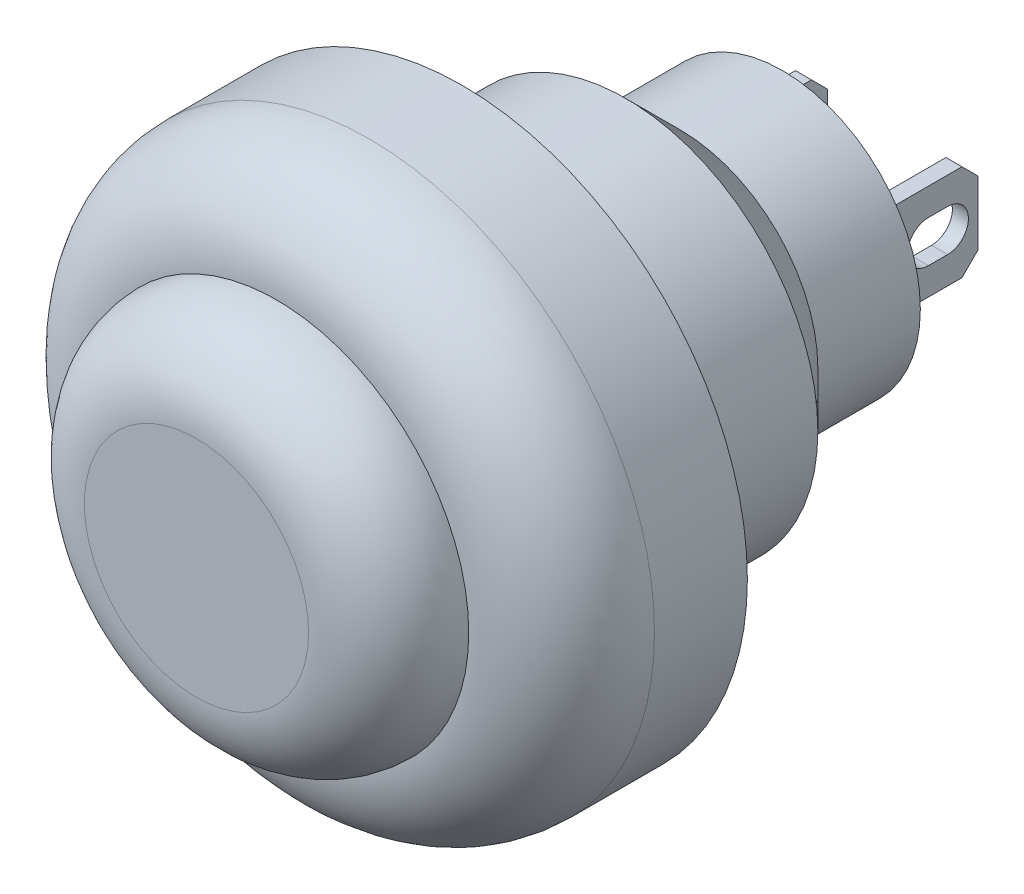
ISO-10303-21;
HEADER;
FILE_DESCRIPTION(('STEP AP214'),'2;1');
FILE_NAME('part.step','',(''),(''),'','','');
FILE_SCHEMA(('AUTOMOTIVE_DESIGN { 1 0 10303 214 1 1 1 1 }'));
ENDSEC;
DATA;
#1=APPLICATION_CONTEXT('core data for automotive mechanical design processes');
#2=APPLICATION_PROTOCOL_DEFINITION('international standard','automotive_design',2000,#1);
#3=PRODUCT_CONTEXT('',#1,'mechanical');
#4=PRODUCT('Part','Part','',(#3));
#5=PRODUCT_RELATED_PRODUCT_CATEGORY('part','',(#4));
#6=PRODUCT_DEFINITION_FORMATION('','',#4);
#7=PRODUCT_DEFINITION_CONTEXT('part definition',#1,'design');
#8=PRODUCT_DEFINITION('design','',#6,#7);
#9=PRODUCT_DEFINITION_SHAPE('','',#8);
#10=(LENGTH_UNIT() NAMED_UNIT(*) SI_UNIT(.MILLI.,.METRE.));
#11=(NAMED_UNIT(*) PLANE_ANGLE_UNIT() SI_UNIT($,.RADIAN.));
#12=(NAMED_UNIT(*) SI_UNIT($,.STERADIAN.) SOLID_ANGLE_UNIT());
#13=UNCERTAINTY_MEASURE_WITH_UNIT(LENGTH_MEASURE(1.E-05),#10,'distance_accuracy_value','');
#14=(GEOMETRIC_REPRESENTATION_CONTEXT(3) GLOBAL_UNCERTAINTY_ASSIGNED_CONTEXT((#13)) GLOBAL_UNIT_ASSIGNED_CONTEXT((#10,
#11,#12)) REPRESENTATION_CONTEXT('',''));
#15=CARTESIAN_POINT('',(0.,0.,0.));
#16=DIRECTION('',(0.,0.,1.));
#17=DIRECTION('',(1.,0.,0.));
#18=AXIS2_PLACEMENT_3D('',#15,#16,#17);
#19=CARTESIAN_POINT('',(0.,0.,-10.));
#20=DIRECTION('',(0.,0.,-1.));
#21=DIRECTION('',(-1.,0.,0.));
#22=AXIS2_PLACEMENT_3D('',#19,#20,#21);
#23=PLANE('',#22);
#24=CARTESIAN_POINT('',(0.,0.,-10.));
#25=DIRECTION('',(0.,0.,-1.));
#26=DIRECTION('',(-1.,0.,0.));
#27=AXIS2_PLACEMENT_3D('',#24,#25,#26);
#28=CIRCLE('',#27,4.3);
#29=CARTESIAN_POINT('',(-4.3,0.,-10.));
#30=VERTEX_POINT('',#29);
#31=EDGE_CURVE('E286',#30,#30,#28,.T.);
#32=ORIENTED_EDGE('',*,*,#31,.T.);
#33=EDGE_LOOP('',(#32));
#34=FACE_BOUND('',#33,.T.);
#35=DIRECTION('',(0.,1.,0.));
#36=VECTOR('',#35,1.);
#37=CARTESIAN_POINT('',(-2.6,-1.5,-10.));
#38=LINE('',#37,#36);
#39=CARTESIAN_POINT('',(-2.6,-1.5,-10.));
#40=VERTEX_POINT('',#39);
#41=CARTESIAN_POINT('',(-2.6,1.5,-10.));
#42=VERTEX_POINT('',#41);
#43=EDGE_CURVE('E271',#40,#42,#38,.T.);
#44=ORIENTED_EDGE('',*,*,#43,.F.);
#45=DIRECTION('',(-1.,0.,0.));
#46=VECTOR('',#45,1.);
#47=CARTESIAN_POINT('',(-2.1,-1.5,-10.));
#48=LINE('',#47,#46);
#49=CARTESIAN_POINT('',(-2.1,-1.5,-10.));
#50=VERTEX_POINT('',#49);
#51=EDGE_CURVE('E260',#50,#40,#48,.T.);
#52=ORIENTED_EDGE('',*,*,#51,.F.);
#53=DIRECTION('',(0.,-1.,0.));
#54=VECTOR('',#53,1.);
#55=CARTESIAN_POINT('',(-2.1,0.,-10.));
#56=LINE('',#55,#54);
#57=CARTESIAN_POINT('',(-2.1,1.5,-10.));
#58=VERTEX_POINT('',#57);
#59=EDGE_CURVE('E265',#58,#50,#56,.T.);
#60=ORIENTED_EDGE('',*,*,#59,.F.);
#61=DIRECTION('',(1.,0.,0.));
#62=VECTOR('',#61,1.);
#63=CARTESIAN_POINT('',(-2.6,1.5,-10.));
#64=LINE('',#63,#62);
#65=EDGE_CURVE('E274',#42,#58,#64,.T.);
#66=ORIENTED_EDGE('',*,*,#65,.F.);
#67=EDGE_LOOP('',(#44,#52,#60,#66));
#68=FACE_BOUND('',#67,.T.);
#69=DIRECTION('',(-1.,0.,0.));
#70=VECTOR('',#69,1.);
#71=CARTESIAN_POINT('',(2.6,-1.5,-10.));
#72=LINE('',#71,#70);
#73=CARTESIAN_POINT('',(2.6,-1.5,-10.));
#74=VERTEX_POINT('',#73);
#75=CARTESIAN_POINT('',(2.1,-1.5,-10.));
#76=VERTEX_POINT('',#75);
#77=EDGE_CURVE('E245',#74,#76,#72,.T.);
#78=ORIENTED_EDGE('',*,*,#77,.F.);
#79=DIRECTION('',(0.,-1.,0.));
#80=VECTOR('',#79,1.);
#81=CARTESIAN_POINT('',(2.6,-1.5,-10.));
#82=LINE('',#81,#80);
#83=CARTESIAN_POINT('',(2.6,1.5,-10.));
#84=VERTEX_POINT('',#83);
#85=EDGE_CURVE('E234',#84,#74,#82,.T.);
#86=ORIENTED_EDGE('',*,*,#85,.F.);
#87=DIRECTION('',(1.,0.,0.));
#88=VECTOR('',#87,1.);
#89=CARTESIAN_POINT('',(2.6,1.5,-10.));
#90=LINE('',#89,#88);
#91=CARTESIAN_POINT('',(2.1,1.5,-10.));
#92=VERTEX_POINT('',#91);
#93=EDGE_CURVE('E239',#92,#84,#90,.T.);
#94=ORIENTED_EDGE('',*,*,#93,.F.);
#95=DIRECTION('',(0.,1.,0.));
#96=VECTOR('',#95,1.);
#97=CARTESIAN_POINT('',(2.1,0.,-10.));
#98=LINE('',#97,#96);
#99=EDGE_CURVE('E248',#76,#92,#98,.T.);
#100=ORIENTED_EDGE('',*,*,#99,.F.);
#101=EDGE_LOOP('',(#78,#86,#94,#100));
#102=FACE_BOUND('',#101,.T.);
#103=ADVANCED_FACE('F36',(#34,#68,#102),#23,.T.);
#104=CARTESIAN_POINT('',(0.,0.,5.8));
#105=DIRECTION('',(0.,0.,-1.));
#106=DIRECTION('',(-1.,0.,0.));
#107=AXIS2_PLACEMENT_3D('',#104,#105,#106);
#108=CYLINDRICAL_SURFACE('',#107,8.9);
#109=CARTESIAN_POINT('',(0.,0.,2.9));
#110=DIRECTION('',(0.,0.,1.));
#111=DIRECTION('',(1.,0.,0.));
#112=AXIS2_PLACEMENT_3D('',#109,#110,#111);
#113=CIRCLE('',#112,8.9);
#114=CARTESIAN_POINT('',(8.9,0.,2.9));
#115=VERTEX_POINT('',#114);
#116=EDGE_CURVE('E301',#115,#115,#113,.F.);
#117=ORIENTED_EDGE('',*,*,#116,.T.);
#118=EDGE_LOOP('',(#117));
#119=FACE_BOUND('',#118,.T.);
#120=CARTESIAN_POINT('',(0.,0.,0.));
#121=DIRECTION('',(0.,0.,1.));
#122=DIRECTION('',(1.,0.,0.));
#123=AXIS2_PLACEMENT_3D('',#120,#121,#122);
#124=CIRCLE('',#123,8.9);
#125=CARTESIAN_POINT('',(8.9,0.,0.));
#126=VERTEX_POINT('',#125);
#127=EDGE_CURVE('E295',#126,#126,#124,.T.);
#128=ORIENTED_EDGE('',*,*,#127,.T.);
#129=EDGE_LOOP('',(#128));
#130=FACE_BOUND('',#129,.T.);
#131=ADVANCED_FACE('F381',(#119,#130),#108,.T.);
#132=CARTESIAN_POINT('',(0.,0.,0.));
#133=DIRECTION('',(0.,0.,1.));
#134=DIRECTION('',(1.,0.,0.));
#135=AXIS2_PLACEMENT_3D('',#132,#133,#134);
#136=PLANE('',#135);
#137=CARTESIAN_POINT('',(0.,0.,0.));
#138=DIRECTION('',(0.,0.,1.));
#139=DIRECTION('',(1.,0.,0.));
#140=AXIS2_PLACEMENT_3D('',#137,#138,#139);
#141=CIRCLE('',#140,6.75);
#142=CARTESIAN_POINT('',(6.75,0.,0.));
#143=VERTEX_POINT('',#142);
#144=EDGE_CURVE('E304',#143,#143,#141,.F.);
#145=ORIENTED_EDGE('',*,*,#144,.F.);
#146=EDGE_LOOP('',(#145));
#147=FACE_BOUND('',#146,.T.);
#148=ORIENTED_EDGE('',*,*,#127,.F.);
#149=EDGE_LOOP('',(#148));
#150=FACE_BOUND('',#149,.T.);
#151=ADVANCED_FACE('F387',(#147,#150),#136,.F.);
#152=CARTESIAN_POINT('',(0.,0.,2.9));
#153=DIRECTION('',(0.,0.,1.));
#154=DIRECTION('',(1.,0.,0.));
#155=AXIS2_PLACEMENT_3D('',#152,#153,#154);
#156=TOROIDAL_SURFACE('',#155,6.,2.9);
#157=ORIENTED_EDGE('',*,*,#116,.F.);
#158=EDGE_LOOP('',(#157));
#159=FACE_BOUND('',#158,.T.);
#160=CARTESIAN_POINT('',(0.,0.,5.8));
#161=DIRECTION('',(0.,0.,1.));
#162=DIRECTION('',(1.,0.,0.));
#163=AXIS2_PLACEMENT_3D('',#160,#161,#162);
#164=CIRCLE('',#163,6.);
#165=CARTESIAN_POINT('',(6.,0.,5.8));
#166=VERTEX_POINT('',#165);
#167=EDGE_CURVE('E298',#166,#166,#164,.T.);
#168=ORIENTED_EDGE('',*,*,#167,.F.);
#169=EDGE_LOOP('',(#168));
#170=FACE_BOUND('',#169,.T.);
#171=ADVANCED_FACE('F411',(#159,#170),#156,.T.);
#172=CARTESIAN_POINT('',(0.,0.,-1.));
#173=DIRECTION('',(0.,0.,1.));
#174=DIRECTION('',(1.,0.,0.));
#175=AXIS2_PLACEMENT_3D('',#172,#173,#174);
#176=CYLINDRICAL_SURFACE('',#175,6.75);
#177=CARTESIAN_POINT('',(0.,0.,-1.));
#178=DIRECTION('',(0.,0.,-1.));
#179=DIRECTION('',(-1.,0.,0.));
#180=AXIS2_PLACEMENT_3D('',#177,#178,#179);
#181=CIRCLE('',#180,6.75);
#182=CARTESIAN_POINT('',(-6.75,0.,-1.));
#183=VERTEX_POINT('',#182);
#184=EDGE_CURVE('E292',#183,#183,#181,.T.);
#185=ORIENTED_EDGE('',*,*,#184,.F.);
#186=EDGE_LOOP('',(#185));
#187=FACE_BOUND('',#186,.T.);
#188=ORIENTED_EDGE('',*,*,#144,.T.);
#189=EDGE_LOOP('',(#188));
#190=FACE_BOUND('',#189,.T.);
#191=ADVANCED_FACE('F407',(#187,#190),#176,.T.);
#192=CARTESIAN_POINT('',(0.,0.,-1.));
#193=DIRECTION('',(0.,0.,-1.));
#194=DIRECTION('',(-1.,0.,0.));
#195=AXIS2_PLACEMENT_3D('',#192,#193,#194);
#196=PLANE('',#195);
#197=CARTESIAN_POINT('',(0.,0.,-1.));
#198=DIRECTION('',(0.,0.,-1.));
#199=DIRECTION('',(-1.,0.,0.));
#200=AXIS2_PLACEMENT_3D('',#197,#198,#199);
#201=CIRCLE('',#200,6.);
#202=CARTESIAN_POINT('',(-6.,0.,-1.));
#203=VERTEX_POINT('',#202);
#204=EDGE_CURVE('E289',#203,#203,#201,.T.);
#205=ORIENTED_EDGE('',*,*,#204,.F.);
#206=EDGE_LOOP('',(#205));
#207=FACE_BOUND('',#206,.T.);
#208=ORIENTED_EDGE('',*,*,#184,.T.);
#209=EDGE_LOOP('',(#208));
#210=FACE_BOUND('',#209,.T.);
#211=ADVANCED_FACE('F403',(#207,#210),#196,.T.);
#212=CARTESIAN_POINT('',(0.,0.,-8.5));
#213=DIRECTION('',(0.,0.,1.));
#214=DIRECTION('',(1.,0.,0.));
#215=AXIS2_PLACEMENT_3D('',#212,#213,#214);
#216=CYLINDRICAL_SURFACE('',#215,6.);
#217=CARTESIAN_POINT('',(0.,0.,-5.09999999999998));
#218=DIRECTION('',(0.,0.,-1.));
#219=DIRECTION('',(-1.,0.,0.));
#220=AXIS2_PLACEMENT_3D('',#217,#218,#219);
#221=CIRCLE('',#220,6.);
#222=CARTESIAN_POINT('',(-6.,0.,-5.09999999999998));
#223=VERTEX_POINT('',#222);
#224=EDGE_CURVE('E307',#223,#223,#221,.F.);
#225=ORIENTED_EDGE('',*,*,#224,.T.);
#226=EDGE_LOOP('',(#225));
#227=FACE_BOUND('',#226,.T.);
#228=ORIENTED_EDGE('',*,*,#204,.T.);
#229=EDGE_LOOP('',(#228));
#230=FACE_BOUND('',#229,.T.);
#231=ADVANCED_FACE('F399',(#227,#230),#216,.T.);
#232=CARTESIAN_POINT('',(0.,0.,-10.));
#233=DIRECTION('',(0.,0.,1.));
#234=DIRECTION('',(1.,0.,0.));
#235=AXIS2_PLACEMENT_3D('',#232,#233,#234);
#236=CYLINDRICAL_SURFACE('',#235,4.3);
#237=CARTESIAN_POINT('',(0.,0.,-6.79999999999996));
#238=DIRECTION('',(0.,0.,1.));
#239=DIRECTION('',(1.,0.,0.));
#240=AXIS2_PLACEMENT_3D('',#237,#238,#239);
#241=CIRCLE('',#240,4.3);
#242=CARTESIAN_POINT('',(4.3,0.,-6.79999999999996));
#243=VERTEX_POINT('',#242);
#244=EDGE_CURVE('E310',#243,#243,#241,.F.);
#245=ORIENTED_EDGE('',*,*,#244,.T.);
#246=EDGE_LOOP('',(#245));
#247=FACE_BOUND('',#246,.T.);
#248=ORIENTED_EDGE('',*,*,#31,.F.);
#249=EDGE_LOOP('',(#248));
#250=FACE_BOUND('',#249,.T.);
#251=ADVANCED_FACE('F395',(#247,#250),#236,.T.);
#252=CARTESIAN_POINT('',(0.,0.,-8.5));
#253=DIRECTION('',(0.,0.,1.));
#254=DIRECTION('',(1.,0.,0.));
#255=AXIS2_PLACEMENT_3D('',#252,#253,#254);
#256=CONICAL_SURFACE('',#255,2.59999999999994,0.785398163397453);
#257=ORIENTED_EDGE('',*,*,#224,.F.);
#258=EDGE_LOOP('',(#257));
#259=FACE_BOUND('',#258,.T.);
#260=ORIENTED_EDGE('',*,*,#244,.F.);
#261=EDGE_LOOP('',(#260));
#262=FACE_BOUND('',#261,.T.);
#263=ADVANCED_FACE('F398',(#259,#262),#256,.T.);
#264=CARTESIAN_POINT('',(-2.1,-1.5,-13.5));
#265=DIRECTION('',(0.,1.,0.));
#266=DIRECTION('',(0.,0.,1.));
#267=AXIS2_PLACEMENT_3D('',#264,#265,#266);
#268=PLANE('',#267);
#269=DIRECTION('',(0.,0.,1.));
#270=VECTOR('',#269,1.);
#271=CARTESIAN_POINT('',(-2.6,-1.5,-13.5));
#272=LINE('',#271,#270);
#273=CARTESIAN_POINT('',(-2.6,-1.5,-13.));
#274=VERTEX_POINT('',#273);
#275=EDGE_CURVE('E282',#274,#40,#272,.T.);
#276=ORIENTED_EDGE('',*,*,#275,.F.);
#277=DIRECTION('',(1.,0.,0.));
#278=VECTOR('',#277,1.);
#279=CARTESIAN_POINT('',(-2.1,-1.5,-13.));
#280=LINE('',#279,#278);
#281=CARTESIAN_POINT('',(-2.1,-1.5,-13.));
#282=VERTEX_POINT('',#281);
#283=EDGE_CURVE('E335',#274,#282,#280,.T.);
#284=ORIENTED_EDGE('',*,*,#283,.T.);
#285=DIRECTION('',(0.,0.,1.));
#286=VECTOR('',#285,1.);
#287=CARTESIAN_POINT('',(-2.1,-1.5,-13.5));
#288=LINE('',#287,#286);
#289=EDGE_CURVE('E284',#282,#50,#288,.T.);
#290=ORIENTED_EDGE('',*,*,#289,.T.);
#291=ORIENTED_EDGE('',*,*,#51,.T.);
#292=EDGE_LOOP('',(#276,#284,#290,#291));
#293=FACE_BOUND('',#292,.T.);
#294=ADVANCED_FACE('F393',(#293),#268,.F.);
#295=CARTESIAN_POINT('',(-2.6,-1.5,-13.5));
#296=DIRECTION('',(1.,0.,0.));
#297=DIRECTION('',(0.,0.,-1.));
#298=AXIS2_PLACEMENT_3D('',#295,#296,#297);
#299=PLANE('',#298);
#300=DIRECTION('',(0.,0.,1.));
#301=VECTOR('',#300,1.);
#302=CARTESIAN_POINT('',(-2.6,-0.649999999999999,-12.55));
#303=LINE('',#302,#301);
#304=CARTESIAN_POINT('',(-2.6,-0.649999999999999,-12.55));
#305=VERTEX_POINT('',#304);
#306=CARTESIAN_POINT('',(-2.6,-0.649999999999999,-11.95));
#307=VERTEX_POINT('',#306);
#308=EDGE_CURVE('E190',#305,#307,#303,.T.);
#309=ORIENTED_EDGE('',*,*,#308,.F.);
#310=CARTESIAN_POINT('',(-2.6,0.,-12.55));
#311=DIRECTION('',(-1.,0.,0.));
#312=DIRECTION('',(0.,0.,1.));
#313=AXIS2_PLACEMENT_3D('',#310,#311,#312);
#314=CIRCLE('',#313,0.649999999999999);
#315=CARTESIAN_POINT('',(-2.6,0.649999999999999,-12.55));
#316=VERTEX_POINT('',#315);
#317=EDGE_CURVE('E196',#316,#305,#314,.T.);
#318=ORIENTED_EDGE('',*,*,#317,.F.);
#319=DIRECTION('',(0.,0.,-1.));
#320=VECTOR('',#319,1.);
#321=CARTESIAN_POINT('',(-2.6,0.649999999999999,-12.55));
#322=LINE('',#321,#320);
#323=CARTESIAN_POINT('',(-2.6,0.649999999999999,-11.95));
#324=VERTEX_POINT('',#323);
#325=EDGE_CURVE('E201',#324,#316,#322,.T.);
#326=ORIENTED_EDGE('',*,*,#325,.F.);
#327=CARTESIAN_POINT('',(-2.6,0.,-11.95));
#328=DIRECTION('',(-1.,0.,0.));
#329=DIRECTION('',(0.,0.,1.));
#330=AXIS2_PLACEMENT_3D('',#327,#328,#329);
#331=CIRCLE('',#330,0.649999999999999);
#332=EDGE_CURVE('E179',#307,#324,#331,.T.);
#333=ORIENTED_EDGE('',*,*,#332,.F.);
#334=EDGE_LOOP('',(#309,#318,#326,#333));
#335=FACE_BOUND('',#334,.T.);
#336=DIRECTION('',(0.,1.,0.));
#337=VECTOR('',#336,1.);
#338=CARTESIAN_POINT('',(-2.6,-1.5,-13.5));
#339=LINE('',#338,#337);
#340=CARTESIAN_POINT('',(-2.6,-1.,-13.5));
#341=VERTEX_POINT('',#340);
#342=CARTESIAN_POINT('',(-2.6,1.,-13.5));
#343=VERTEX_POINT('',#342);
#344=EDGE_CURVE('E264',#341,#343,#339,.T.);
#345=ORIENTED_EDGE('',*,*,#344,.F.);
#346=DIRECTION('',(0.,-0.707106781186545,0.70710678118655));
#347=VECTOR('',#346,1.);
#348=CARTESIAN_POINT('',(-2.6,-1.,-13.5));
#349=LINE('',#348,#347);
#350=EDGE_CURVE('E333',#341,#274,#349,.T.);
#351=ORIENTED_EDGE('',*,*,#350,.T.);
#352=ORIENTED_EDGE('',*,*,#275,.T.);
#353=ORIENTED_EDGE('',*,*,#43,.T.);
#354=DIRECTION('',(0.,0.,1.));
#355=VECTOR('',#354,1.);
#356=CARTESIAN_POINT('',(-2.6,1.5,-13.5));
#357=LINE('',#356,#355);
#358=CARTESIAN_POINT('',(-2.6,1.5,-13.));
#359=VERTEX_POINT('',#358);
#360=EDGE_CURVE('E280',#359,#42,#357,.T.);
#361=ORIENTED_EDGE('',*,*,#360,.F.);
#362=DIRECTION('',(0.,-0.707106781186545,-0.70710678118655));
#363=VECTOR('',#362,1.);
#364=CARTESIAN_POINT('',(-2.6,1.,-13.5));
#365=LINE('',#364,#363);
#366=EDGE_CURVE('E331',#359,#343,#365,.T.);
#367=ORIENTED_EDGE('',*,*,#366,.T.);
#368=EDGE_LOOP('',(#345,#351,#352,#353,#361,#367));
#369=FACE_BOUND('',#368,.T.);
#370=ADVANCED_FACE('F198',(#335,#369),#299,.F.);
#371=CARTESIAN_POINT('',(-2.6,1.5,-13.5));
#372=DIRECTION('',(0.,-1.,0.));
#373=DIRECTION('',(0.,0.,-1.));
#374=AXIS2_PLACEMENT_3D('',#371,#372,#373);
#375=PLANE('',#374);
#376=DIRECTION('',(0.,0.,1.));
#377=VECTOR('',#376,1.);
#378=CARTESIAN_POINT('',(-2.1,1.5,-13.5));
#379=LINE('',#378,#377);
#380=CARTESIAN_POINT('',(-2.1,1.5,-13.));
#381=VERTEX_POINT('',#380);
#382=EDGE_CURVE('E268',#381,#58,#379,.T.);
#383=ORIENTED_EDGE('',*,*,#382,.F.);
#384=DIRECTION('',(-1.,0.,0.));
#385=VECTOR('',#384,1.);
#386=CARTESIAN_POINT('',(-2.6,1.5,-13.));
#387=LINE('',#386,#385);
#388=EDGE_CURVE('E341',#381,#359,#387,.T.);
#389=ORIENTED_EDGE('',*,*,#388,.T.);
#390=ORIENTED_EDGE('',*,*,#360,.T.);
#391=ORIENTED_EDGE('',*,*,#65,.T.);
#392=EDGE_LOOP('',(#383,#389,#390,#391));
#393=FACE_BOUND('',#392,.T.);
#394=ADVANCED_FACE('F478',(#393),#375,.F.);
#395=CARTESIAN_POINT('',(-2.1,0.,-13.5));
#396=DIRECTION('',(-1.,0.,0.));
#397=DIRECTION('',(0.,0.,1.));
#398=AXIS2_PLACEMENT_3D('',#395,#396,#397);
#399=PLANE('',#398);
#400=DIRECTION('',(0.,0.,-1.));
#401=VECTOR('',#400,1.);
#402=CARTESIAN_POINT('',(-2.1,0.649999999999999,-13.5));
#403=LINE('',#402,#401);
#404=CARTESIAN_POINT('',(-2.1,0.649999999999999,-11.95));
#405=VERTEX_POINT('',#404);
#406=CARTESIAN_POINT('',(-2.1,0.649999999999999,-12.55));
#407=VERTEX_POINT('',#406);
#408=EDGE_CURVE('E225',#405,#407,#403,.T.);
#409=ORIENTED_EDGE('',*,*,#408,.T.);
#410=CARTESIAN_POINT('',(-2.1,0.,-12.55));
#411=DIRECTION('',(-1.,0.,0.));
#412=DIRECTION('',(0.,0.,1.));
#413=AXIS2_PLACEMENT_3D('',#410,#411,#412);
#414=CIRCLE('',#413,0.649999999999999);
#415=CARTESIAN_POINT('',(-2.1,-0.649999999999999,-12.55));
#416=VERTEX_POINT('',#415);
#417=EDGE_CURVE('E231',#407,#416,#414,.T.);
#418=ORIENTED_EDGE('',*,*,#417,.T.);
#419=DIRECTION('',(0.,0.,1.));
#420=VECTOR('',#419,1.);
#421=CARTESIAN_POINT('',(-2.1,-0.649999999999999,-13.5));
#422=LINE('',#421,#420);
#423=CARTESIAN_POINT('',(-2.1,-0.649999999999999,-11.95));
#424=VERTEX_POINT('',#423);
#425=EDGE_CURVE('E216',#416,#424,#422,.T.);
#426=ORIENTED_EDGE('',*,*,#425,.T.);
#427=CARTESIAN_POINT('',(-2.1,0.,-11.95));
#428=DIRECTION('',(-1.,0.,0.));
#429=DIRECTION('',(0.,0.,1.));
#430=AXIS2_PLACEMENT_3D('',#427,#428,#429);
#431=CIRCLE('',#430,0.649999999999999);
#432=EDGE_CURVE('E182',#424,#405,#431,.T.);
#433=ORIENTED_EDGE('',*,*,#432,.T.);
#434=EDGE_LOOP('',(#409,#418,#426,#433));
#435=FACE_BOUND('',#434,.T.);
#436=ORIENTED_EDGE('',*,*,#289,.F.);
#437=DIRECTION('',(0.,0.707106781186545,-0.70710678118655));
#438=VECTOR('',#437,1.);
#439=CARTESIAN_POINT('',(-2.1,-1.,-13.5));
#440=LINE('',#439,#438);
#441=CARTESIAN_POINT('',(-2.1,-1.,-13.5));
#442=VERTEX_POINT('',#441);
#443=EDGE_CURVE('E339',#282,#442,#440,.T.);
#444=ORIENTED_EDGE('',*,*,#443,.T.);
#445=DIRECTION('',(0.,-1.,0.));
#446=VECTOR('',#445,1.);
#447=CARTESIAN_POINT('',(-2.1,0.,-13.5));
#448=LINE('',#447,#446);
#449=CARTESIAN_POINT('',(-2.1,1.,-13.5));
#450=VERTEX_POINT('',#449);
#451=EDGE_CURVE('E261',#450,#442,#448,.T.);
#452=ORIENTED_EDGE('',*,*,#451,.F.);
#453=DIRECTION('',(0.,0.707106781186545,0.70710678118655));
#454=VECTOR('',#453,1.);
#455=CARTESIAN_POINT('',(-2.1,1.,-13.5));
#456=LINE('',#455,#454);
#457=EDGE_CURVE('E337',#450,#381,#456,.T.);
#458=ORIENTED_EDGE('',*,*,#457,.T.);
#459=ORIENTED_EDGE('',*,*,#382,.T.);
#460=ORIENTED_EDGE('',*,*,#59,.T.);
#461=EDGE_LOOP('',(#436,#444,#452,#458,#459,#460));
#462=FACE_BOUND('',#461,.T.);
#463=ADVANCED_FACE('F474',(#435,#462),#399,.F.);
#464=CARTESIAN_POINT('',(0.,0.,-13.5));
#465=DIRECTION('',(0.,0.,-1.));
#466=DIRECTION('',(-1.,0.,0.));
#467=AXIS2_PLACEMENT_3D('',#464,#465,#466);
#468=PLANE('',#467);
#469=ORIENTED_EDGE('',*,*,#451,.T.);
#470=DIRECTION('',(-1.,0.,0.));
#471=VECTOR('',#470,1.);
#472=CARTESIAN_POINT('',(-2.6,-1.,-13.5));
#473=LINE('',#472,#471);
#474=EDGE_CURVE('E328',#442,#341,#473,.T.);
#475=ORIENTED_EDGE('',*,*,#474,.T.);
#476=ORIENTED_EDGE('',*,*,#344,.T.);
#477=DIRECTION('',(1.,0.,0.));
#478=VECTOR('',#477,1.);
#479=CARTESIAN_POINT('',(-2.1,1.,-13.5));
#480=LINE('',#479,#478);
#481=EDGE_CURVE('E325',#343,#450,#480,.T.);
#482=ORIENTED_EDGE('',*,*,#481,.T.);
#483=EDGE_LOOP('',(#469,#475,#476,#482));
#484=FACE_BOUND('',#483,.T.);
#485=ADVANCED_FACE('F470',(#484),#468,.T.);
#486=CARTESIAN_POINT('',(2.6,-1.5,-13.5));
#487=DIRECTION('',(-1.,0.,0.));
#488=DIRECTION('',(0.,0.,1.));
#489=AXIS2_PLACEMENT_3D('',#486,#487,#488);
#490=PLANE('',#489);
#491=DIRECTION('',(0.,0.,-1.));
#492=VECTOR('',#491,1.);
#493=CARTESIAN_POINT('',(2.6,0.649999999999999,-13.5));
#494=LINE('',#493,#492);
#495=CARTESIAN_POINT('',(2.6,0.649999999999999,-11.95));
#496=VERTEX_POINT('',#495);
#497=CARTESIAN_POINT('',(2.6,0.649999999999999,-12.55));
#498=VERTEX_POINT('',#497);
#499=EDGE_CURVE('E222',#496,#498,#494,.T.);
#500=ORIENTED_EDGE('',*,*,#499,.T.);
#501=CARTESIAN_POINT('',(2.6,0.,-12.55));
#502=DIRECTION('',(-1.,0.,0.));
#503=DIRECTION('',(0.,0.,1.));
#504=AXIS2_PLACEMENT_3D('',#501,#502,#503);
#505=CIRCLE('',#504,0.649999999999999);
#506=CARTESIAN_POINT('',(2.6,-0.649999999999999,-12.55));
#507=VERTEX_POINT('',#506);
#508=EDGE_CURVE('E228',#498,#507,#505,.T.);
#509=ORIENTED_EDGE('',*,*,#508,.T.);
#510=DIRECTION('',(0.,0.,1.));
#511=VECTOR('',#510,1.);
#512=CARTESIAN_POINT('',(2.6,-0.649999999999999,-13.5));
#513=LINE('',#512,#511);
#514=CARTESIAN_POINT('',(2.6,-0.649999999999999,-11.95));
#515=VERTEX_POINT('',#514);
#516=EDGE_CURVE('E213',#507,#515,#513,.T.);
#517=ORIENTED_EDGE('',*,*,#516,.T.);
#518=CARTESIAN_POINT('',(2.6,0.,-11.95));
#519=DIRECTION('',(-1.,0.,0.));
#520=DIRECTION('',(0.,0.,1.));
#521=AXIS2_PLACEMENT_3D('',#518,#519,#520);
#522=CIRCLE('',#521,0.649999999999999);
#523=EDGE_CURVE('E218',#515,#496,#522,.T.);
#524=ORIENTED_EDGE('',*,*,#523,.T.);
#525=EDGE_LOOP('',(#500,#509,#517,#524));
#526=FACE_BOUND('',#525,.T.);
#527=DIRECTION('',(0.,-1.,0.));
#528=VECTOR('',#527,1.);
#529=CARTESIAN_POINT('',(2.6,-1.5,-13.5));
#530=LINE('',#529,#528);
#531=CARTESIAN_POINT('',(2.6,1.,-13.5));
#532=VERTEX_POINT('',#531);
#533=CARTESIAN_POINT('',(2.6,-1.,-13.5));
#534=VERTEX_POINT('',#533);
#535=EDGE_CURVE('E235',#532,#534,#530,.T.);
#536=ORIENTED_EDGE('',*,*,#535,.F.);
#537=DIRECTION('',(0.,-0.707106781186545,-0.70710678118655));
#538=VECTOR('',#537,1.);
#539=CARTESIAN_POINT('',(2.6,1.,-13.5));
#540=LINE('',#539,#538);
#541=CARTESIAN_POINT('',(2.6,1.5,-13.));
#542=VERTEX_POINT('',#541);
#543=EDGE_CURVE('E351',#532,#542,#540,.F.);
#544=ORIENTED_EDGE('',*,*,#543,.T.);
#545=DIRECTION('',(0.,0.,1.));
#546=VECTOR('',#545,1.);
#547=CARTESIAN_POINT('',(2.6,1.5,-13.5));
#548=LINE('',#547,#546);
#549=EDGE_CURVE('E242',#542,#84,#548,.T.);
#550=ORIENTED_EDGE('',*,*,#549,.T.);
#551=ORIENTED_EDGE('',*,*,#85,.T.);
#552=DIRECTION('',(0.,0.,1.));
#553=VECTOR('',#552,1.);
#554=CARTESIAN_POINT('',(2.6,-1.5,-13.5));
#555=LINE('',#554,#553);
#556=CARTESIAN_POINT('',(2.6,-1.5,-13.));
#557=VERTEX_POINT('',#556);
#558=EDGE_CURVE('E258',#557,#74,#555,.T.);
#559=ORIENTED_EDGE('',*,*,#558,.F.);
#560=DIRECTION('',(0.,-0.707106781186545,0.70710678118655));
#561=VECTOR('',#560,1.);
#562=CARTESIAN_POINT('',(2.6,-1.,-13.5));
#563=LINE('',#562,#561);
#564=EDGE_CURVE('E349',#557,#534,#563,.F.);
#565=ORIENTED_EDGE('',*,*,#564,.T.);
#566=EDGE_LOOP('',(#536,#544,#550,#551,#559,#565));
#567=FACE_BOUND('',#566,.T.);
#568=ADVANCED_FACE('F364',(#526,#567),#490,.F.);
#569=CARTESIAN_POINT('',(2.6,-1.5,-13.5));
#570=DIRECTION('',(0.,1.,0.));
#571=DIRECTION('',(0.,0.,1.));
#572=AXIS2_PLACEMENT_3D('',#569,#570,#571);
#573=PLANE('',#572);
#574=DIRECTION('',(0.,0.,1.));
#575=VECTOR('',#574,1.);
#576=CARTESIAN_POINT('',(2.1,-1.5,-13.5));
#577=LINE('',#576,#575);
#578=CARTESIAN_POINT('',(2.1,-1.5,-13.));
#579=VERTEX_POINT('',#578);
#580=EDGE_CURVE('E256',#579,#76,#577,.T.);
#581=ORIENTED_EDGE('',*,*,#580,.F.);
#582=DIRECTION('',(1.,0.,0.));
#583=VECTOR('',#582,1.);
#584=CARTESIAN_POINT('',(2.6,-1.5,-13.));
#585=LINE('',#584,#583);
#586=EDGE_CURVE('E44',#579,#557,#585,.T.);
#587=ORIENTED_EDGE('',*,*,#586,.T.);
#588=ORIENTED_EDGE('',*,*,#558,.T.);
#589=ORIENTED_EDGE('',*,*,#77,.T.);
#590=EDGE_LOOP('',(#581,#587,#588,#589));
#591=FACE_BOUND('',#590,.T.);
#592=ADVANCED_FACE('F359',(#591),#573,.F.);
#593=CARTESIAN_POINT('',(2.1,0.,-13.5));
#594=DIRECTION('',(1.,0.,0.));
#595=DIRECTION('',(0.,0.,-1.));
#596=AXIS2_PLACEMENT_3D('',#593,#594,#595);
#597=PLANE('',#596);
#598=DIRECTION('',(0.,0.,-1.));
#599=VECTOR('',#598,1.);
#600=CARTESIAN_POINT('',(2.1,-0.649999999999999,-13.5));
#601=LINE('',#600,#599);
#602=CARTESIAN_POINT('',(2.1,-0.649999999999999,-11.95));
#603=VERTEX_POINT('',#602);
#604=CARTESIAN_POINT('',(2.1,-0.649999999999999,-12.55));
#605=VERTEX_POINT('',#604);
#606=EDGE_CURVE('E313',#603,#605,#601,.T.);
#607=ORIENTED_EDGE('',*,*,#606,.T.);
#608=CARTESIAN_POINT('',(2.1,0.,-12.55));
#609=DIRECTION('',(1.,0.,0.));
#610=DIRECTION('',(0.,0.,-1.));
#611=AXIS2_PLACEMENT_3D('',#608,#609,#610);
#612=CIRCLE('',#611,0.649999999999999);
#613=CARTESIAN_POINT('',(2.1,0.649999999999999,-12.55));
#614=VERTEX_POINT('',#613);
#615=EDGE_CURVE('E322',#605,#614,#612,.T.);
#616=ORIENTED_EDGE('',*,*,#615,.T.);
#617=DIRECTION('',(0.,0.,1.));
#618=VECTOR('',#617,1.);
#619=CARTESIAN_POINT('',(2.1,0.649999999999999,-13.5));
#620=LINE('',#619,#618);
#621=CARTESIAN_POINT('',(2.1,0.649999999999999,-11.95));
#622=VERTEX_POINT('',#621);
#623=EDGE_CURVE('E319',#614,#622,#620,.T.);
#624=ORIENTED_EDGE('',*,*,#623,.T.);
#625=CARTESIAN_POINT('',(2.1,0.,-11.95));
#626=DIRECTION('',(1.,0.,0.));
#627=DIRECTION('',(0.,0.,-1.));
#628=AXIS2_PLACEMENT_3D('',#625,#626,#627);
#629=CIRCLE('',#628,0.649999999999999);
#630=EDGE_CURVE('E316',#622,#603,#629,.T.);
#631=ORIENTED_EDGE('',*,*,#630,.T.);
#632=EDGE_LOOP('',(#607,#616,#624,#631));
#633=FACE_BOUND('',#632,.T.);
#634=DIRECTION('',(0.,0.,1.));
#635=VECTOR('',#634,1.);
#636=CARTESIAN_POINT('',(2.1,1.5,-13.5));
#637=LINE('',#636,#635);
#638=CARTESIAN_POINT('',(2.1,1.5,-13.));
#639=VERTEX_POINT('',#638);
#640=EDGE_CURVE('E254',#639,#92,#637,.T.);
#641=ORIENTED_EDGE('',*,*,#640,.F.);
#642=DIRECTION('',(0.,0.707106781186545,0.70710678118655));
#643=VECTOR('',#642,1.);
#644=CARTESIAN_POINT('',(2.1,1.,-13.5));
#645=LINE('',#644,#643);
#646=CARTESIAN_POINT('',(2.1,1.,-13.5));
#647=VERTEX_POINT('',#646);
#648=EDGE_CURVE('E355',#639,#647,#645,.F.);
#649=ORIENTED_EDGE('',*,*,#648,.T.);
#650=DIRECTION('',(0.,1.,0.));
#651=VECTOR('',#650,1.);
#652=CARTESIAN_POINT('',(2.1,0.,-13.5));
#653=LINE('',#652,#651);
#654=CARTESIAN_POINT('',(2.1,-1.,-13.5));
#655=VERTEX_POINT('',#654);
#656=EDGE_CURVE('E238',#655,#647,#653,.T.);
#657=ORIENTED_EDGE('',*,*,#656,.F.);
#658=DIRECTION('',(0.,0.707106781186545,-0.70710678118655));
#659=VECTOR('',#658,1.);
#660=CARTESIAN_POINT('',(2.1,-1.,-13.5));
#661=LINE('',#660,#659);
#662=EDGE_CURVE('E51',#655,#579,#661,.F.);
#663=ORIENTED_EDGE('',*,*,#662,.T.);
#664=ORIENTED_EDGE('',*,*,#580,.T.);
#665=ORIENTED_EDGE('',*,*,#99,.T.);
#666=EDGE_LOOP('',(#641,#649,#657,#663,#664,#665));
#667=FACE_BOUND('',#666,.T.);
#668=ADVANCED_FACE('F372',(#633,#667),#597,.F.);
#669=CARTESIAN_POINT('',(2.6,1.5,-13.5));
#670=DIRECTION('',(0.,-1.,0.));
#671=DIRECTION('',(0.,0.,-1.));
#672=AXIS2_PLACEMENT_3D('',#669,#670,#671);
#673=PLANE('',#672);
#674=ORIENTED_EDGE('',*,*,#549,.F.);
#675=DIRECTION('',(-1.,0.,0.));
#676=VECTOR('',#675,1.);
#677=CARTESIAN_POINT('',(2.6,1.5,-13.));
#678=LINE('',#677,#676);
#679=EDGE_CURVE('E59',#542,#639,#678,.T.);
#680=ORIENTED_EDGE('',*,*,#679,.T.);
#681=ORIENTED_EDGE('',*,*,#640,.T.);
#682=ORIENTED_EDGE('',*,*,#93,.T.);
#683=EDGE_LOOP('',(#674,#680,#681,#682));
#684=FACE_BOUND('',#683,.T.);
#685=ADVANCED_FACE('F376',(#684),#673,.F.);
#686=CARTESIAN_POINT('',(0.,0.,-13.5));
#687=DIRECTION('',(0.,0.,1.));
#688=DIRECTION('',(1.,0.,0.));
#689=AXIS2_PLACEMENT_3D('',#686,#687,#688);
#690=PLANE('',#689);
#691=ORIENTED_EDGE('',*,*,#656,.T.);
#692=DIRECTION('',(1.,0.,0.));
#693=VECTOR('',#692,1.);
#694=CARTESIAN_POINT('',(0.,1.,-13.5));
#695=LINE('',#694,#693);
#696=EDGE_CURVE('E346',#647,#532,#695,.T.);
#697=ORIENTED_EDGE('',*,*,#696,.T.);
#698=ORIENTED_EDGE('',*,*,#535,.T.);
#699=DIRECTION('',(-1.,0.,0.));
#700=VECTOR('',#699,1.);
#701=CARTESIAN_POINT('',(0.,-1.,-13.5));
#702=LINE('',#701,#700);
#703=EDGE_CURVE('E343',#534,#655,#702,.T.);
#704=ORIENTED_EDGE('',*,*,#703,.T.);
#705=EDGE_LOOP('',(#691,#697,#698,#704));
#706=FACE_BOUND('',#705,.T.);
#707=ADVANCED_FACE('F370',(#706),#690,.F.);
#708=CARTESIAN_POINT('',(3.9,-0.649999999999999,-12.55));
#709=DIRECTION('',(0.,-1.,0.));
#710=DIRECTION('',(0.,0.,-1.));
#711=AXIS2_PLACEMENT_3D('',#708,#709,#710);
#712=PLANE('',#711);
#713=DIRECTION('',(-1.,0.,0.));
#714=VECTOR('',#713,1.);
#715=CARTESIAN_POINT('',(3.9,-0.649999999999999,-12.55));
#716=LINE('',#715,#714);
#717=EDGE_CURVE('E186',#507,#605,#716,.T.);
#718=ORIENTED_EDGE('',*,*,#717,.T.);
#719=ORIENTED_EDGE('',*,*,#606,.F.);
#720=DIRECTION('',(-1.,0.,0.));
#721=VECTOR('',#720,1.);
#722=CARTESIAN_POINT('',(3.9,-0.649999999999999,-11.95));
#723=LINE('',#722,#721);
#724=EDGE_CURVE('E185',#515,#603,#723,.T.);
#725=ORIENTED_EDGE('',*,*,#724,.F.);
#726=ORIENTED_EDGE('',*,*,#516,.F.);
#727=EDGE_LOOP('',(#718,#719,#725,#726));
#728=FACE_BOUND('',#727,.T.);
#729=ADVANCED_FACE('F454',(#728),#712,.F.);
#730=CARTESIAN_POINT('',(3.9,0.,-11.95));
#731=DIRECTION('',(-1.,0.,0.));
#732=DIRECTION('',(0.,0.,1.));
#733=AXIS2_PLACEMENT_3D('',#730,#731,#732);
#734=CYLINDRICAL_SURFACE('',#733,0.649999999999999);
#735=ORIENTED_EDGE('',*,*,#724,.T.);
#736=ORIENTED_EDGE('',*,*,#630,.F.);
#737=DIRECTION('',(-1.,0.,0.));
#738=VECTOR('',#737,1.);
#739=CARTESIAN_POINT('',(3.9,0.649999999999999,-11.95));
#740=LINE('',#739,#738);
#741=EDGE_CURVE('E209',#496,#622,#740,.T.);
#742=ORIENTED_EDGE('',*,*,#741,.F.);
#743=ORIENTED_EDGE('',*,*,#523,.F.);
#744=EDGE_LOOP('',(#735,#736,#742,#743));
#745=FACE_BOUND('',#744,.T.);
#746=ADVANCED_FACE('F451',(#745),#734,.F.);
#747=CARTESIAN_POINT('',(3.9,0.649999999999999,-12.55));
#748=DIRECTION('',(0.,1.,0.));
#749=DIRECTION('',(0.,0.,1.));
#750=AXIS2_PLACEMENT_3D('',#747,#748,#749);
#751=PLANE('',#750);
#752=ORIENTED_EDGE('',*,*,#741,.T.);
#753=ORIENTED_EDGE('',*,*,#623,.F.);
#754=DIRECTION('',(-1.,0.,0.));
#755=VECTOR('',#754,1.);
#756=CARTESIAN_POINT('',(3.9,0.649999999999999,-12.55));
#757=LINE('',#756,#755);
#758=EDGE_CURVE('E208',#498,#614,#757,.T.);
#759=ORIENTED_EDGE('',*,*,#758,.F.);
#760=ORIENTED_EDGE('',*,*,#499,.F.);
#761=EDGE_LOOP('',(#752,#753,#759,#760));
#762=FACE_BOUND('',#761,.T.);
#763=ADVANCED_FACE('F448',(#762),#751,.F.);
#764=CARTESIAN_POINT('',(3.9,0.,-12.55));
#765=DIRECTION('',(-1.,0.,0.));
#766=DIRECTION('',(0.,0.,1.));
#767=AXIS2_PLACEMENT_3D('',#764,#765,#766);
#768=CYLINDRICAL_SURFACE('',#767,0.649999999999999);
#769=ORIENTED_EDGE('',*,*,#758,.T.);
#770=ORIENTED_EDGE('',*,*,#615,.F.);
#771=ORIENTED_EDGE('',*,*,#717,.F.);
#772=ORIENTED_EDGE('',*,*,#508,.F.);
#773=EDGE_LOOP('',(#769,#770,#771,#772));
#774=FACE_BOUND('',#773,.T.);
#775=ADVANCED_FACE('F457',(#774),#768,.F.);
#776=EDGE_CURVE('E206',#407,#316,#757,.T.);
#777=ORIENTED_EDGE('',*,*,#776,.T.);
#778=ORIENTED_EDGE('',*,*,#317,.T.);
#779=EDGE_CURVE('E193',#416,#305,#716,.T.);
#780=ORIENTED_EDGE('',*,*,#779,.F.);
#781=ORIENTED_EDGE('',*,*,#417,.F.);
#782=EDGE_LOOP('',(#777,#778,#780,#781));
#783=FACE_BOUND('',#782,.T.);
#784=ADVANCED_FACE('F446',(#783),#768,.F.);
#785=EDGE_CURVE('E210',#405,#324,#740,.T.);
#786=ORIENTED_EDGE('',*,*,#785,.T.);
#787=ORIENTED_EDGE('',*,*,#325,.T.);
#788=ORIENTED_EDGE('',*,*,#776,.F.);
#789=ORIENTED_EDGE('',*,*,#408,.F.);
#790=EDGE_LOOP('',(#786,#787,#788,#789));
#791=FACE_BOUND('',#790,.T.);
#792=ADVANCED_FACE('F443',(#791),#751,.F.);
#793=EDGE_CURVE('E174',#424,#307,#723,.T.);
#794=ORIENTED_EDGE('',*,*,#793,.T.);
#795=ORIENTED_EDGE('',*,*,#332,.T.);
#796=ORIENTED_EDGE('',*,*,#785,.F.);
#797=ORIENTED_EDGE('',*,*,#432,.F.);
#798=EDGE_LOOP('',(#794,#795,#796,#797));
#799=FACE_BOUND('',#798,.T.);
#800=ADVANCED_FACE('F176',(#799),#734,.F.);
#801=ORIENTED_EDGE('',*,*,#779,.T.);
#802=ORIENTED_EDGE('',*,*,#308,.T.);
#803=ORIENTED_EDGE('',*,*,#793,.F.);
#804=ORIENTED_EDGE('',*,*,#425,.F.);
#805=EDGE_LOOP('',(#801,#802,#803,#804));
#806=FACE_BOUND('',#805,.T.);
#807=ADVANCED_FACE('F191',(#806),#712,.F.);
#808=CARTESIAN_POINT('',(0.,-1.,-13.5));
#809=DIRECTION('',(0.,-0.70710678118655,-0.707106781186545));
#810=DIRECTION('',(1.,0.,0.));
#811=AXIS2_PLACEMENT_3D('',#808,#809,#810);
#812=PLANE('',#811);
#813=ORIENTED_EDGE('',*,*,#443,.F.);
#814=ORIENTED_EDGE('',*,*,#283,.F.);
#815=ORIENTED_EDGE('',*,*,#350,.F.);
#816=ORIENTED_EDGE('',*,*,#474,.F.);
#817=EDGE_LOOP('',(#813,#814,#815,#816));
#818=FACE_BOUND('',#817,.T.);
#819=ADVANCED_FACE('F422',(#818),#812,.T.);
#820=CARTESIAN_POINT('',(0.,1.,-13.5));
#821=DIRECTION('',(0.,0.70710678118655,-0.707106781186545));
#822=DIRECTION('',(-1.,0.,0.));
#823=AXIS2_PLACEMENT_3D('',#820,#821,#822);
#824=PLANE('',#823);
#825=ORIENTED_EDGE('',*,*,#366,.F.);
#826=ORIENTED_EDGE('',*,*,#388,.F.);
#827=ORIENTED_EDGE('',*,*,#457,.F.);
#828=ORIENTED_EDGE('',*,*,#481,.F.);
#829=EDGE_LOOP('',(#825,#826,#827,#828));
#830=FACE_BOUND('',#829,.T.);
#831=ADVANCED_FACE('F425',(#830),#824,.T.);
#832=CARTESIAN_POINT('',(0.,1.,-13.5));
#833=DIRECTION('',(0.,-0.70710678118655,0.707106781186545));
#834=DIRECTION('',(1.,0.,0.));
#835=AXIS2_PLACEMENT_3D('',#832,#833,#834);
#836=PLANE('',#835);
#837=ORIENTED_EDGE('',*,*,#648,.F.);
#838=ORIENTED_EDGE('',*,*,#679,.F.);
#839=ORIENTED_EDGE('',*,*,#543,.F.);
#840=ORIENTED_EDGE('',*,*,#696,.F.);
#841=EDGE_LOOP('',(#837,#838,#839,#840));
#842=FACE_BOUND('',#841,.T.);
#843=ADVANCED_FACE('F375',(#842),#836,.F.);
#844=CARTESIAN_POINT('',(0.,-1.,-13.5));
#845=DIRECTION('',(0.,0.70710678118655,0.707106781186545));
#846=DIRECTION('',(-1.,0.,0.));
#847=AXIS2_PLACEMENT_3D('',#844,#845,#846);
#848=PLANE('',#847);
#849=ORIENTED_EDGE('',*,*,#564,.F.);
#850=ORIENTED_EDGE('',*,*,#586,.F.);
#851=ORIENTED_EDGE('',*,*,#662,.F.);
#852=ORIENTED_EDGE('',*,*,#703,.F.);
#853=EDGE_LOOP('',(#849,#850,#851,#852));
#854=FACE_BOUND('',#853,.T.);
#855=ADVANCED_FACE('F368',(#854),#848,.F.);
#856=CARTESIAN_POINT('',(0.,0.,8.3));
#857=DIRECTION('',(0.,0.,1.));
#858=DIRECTION('',(1.,0.,0.));
#859=AXIS2_PLACEMENT_3D('',#856,#857,#858);
#860=PLANE('',#859);
#861=CARTESIAN_POINT('',(0.,0.,8.3));
#862=DIRECTION('',(0.,0.,1.));
#863=DIRECTION('',(1.,0.,0.));
#864=AXIS2_PLACEMENT_3D('',#861,#862,#863);
#865=CIRCLE('',#864,3.5);
#866=CARTESIAN_POINT('',(3.5,0.,8.3));
#867=VERTEX_POINT('',#866);
#868=EDGE_CURVE('E11',#867,#867,#865,.T.);
#869=ORIENTED_EDGE('',*,*,#868,.T.);
#870=EDGE_LOOP('',(#869));
#871=FACE_BOUND('',#870,.T.);
#872=ADVANCED_FACE('F432',(#871),#860,.T.);
#873=CARTESIAN_POINT('',(0.,0.,5.8));
#874=DIRECTION('',(0.,0.,1.));
#875=DIRECTION('',(1.,0.,0.));
#876=AXIS2_PLACEMENT_3D('',#873,#874,#875);
#877=TOROIDAL_SURFACE('',#876,3.5,2.5);
#878=ORIENTED_EDGE('',*,*,#167,.T.);
#879=EDGE_LOOP('',(#878));
#880=FACE_BOUND('',#879,.T.);
#881=ORIENTED_EDGE('',*,*,#868,.F.);
#882=EDGE_LOOP('',(#881));
#883=FACE_BOUND('',#882,.T.);
#884=ADVANCED_FACE('F38',(#880,#883),#877,.T.);
#885=CLOSED_SHELL('',(#103,#131,#151,#171,#191,#211,#231,#251,#263,#294,#370,#394,#463,#485,
#568,#592,#668,#685,#707,#729,#746,#763,#775,#784,#792,#800,#807,#819,#831,#843,#855,#872,#884));
#886=MANIFOLD_SOLID_BREP('B2',#885);
#887=ADVANCED_BREP_SHAPE_REPRESENTATION('',(#18,#886),#14);
#888=SHAPE_DEFINITION_REPRESENTATION(#9,#887);
ENDSEC;
END-ISO-10303-21;
